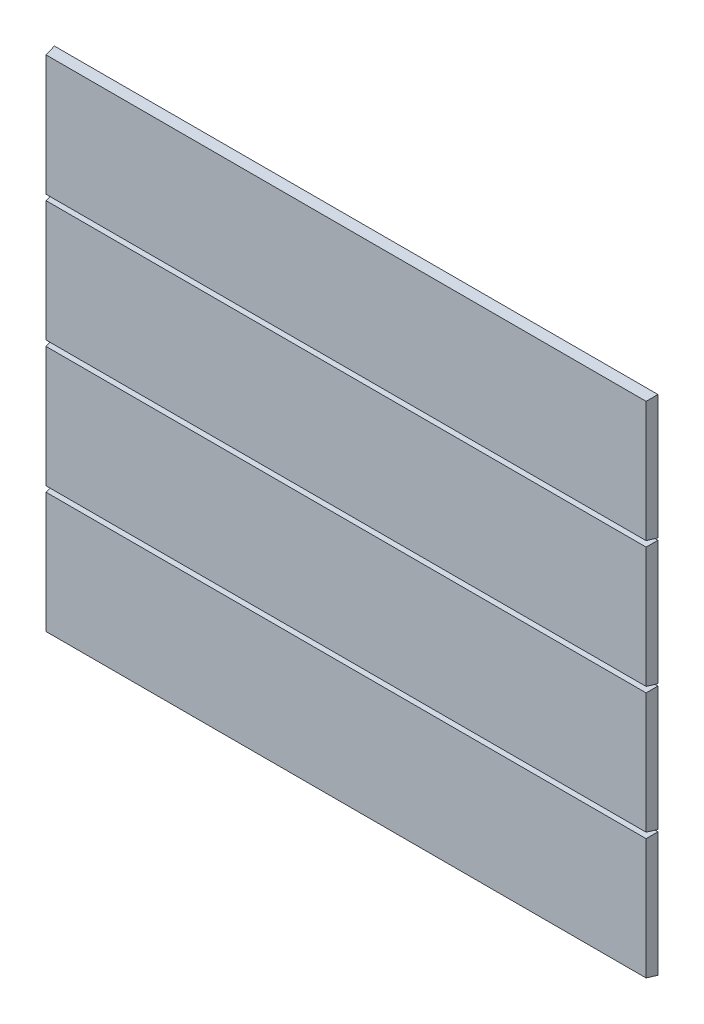
ISO-10303-21;
HEADER;
FILE_DESCRIPTION(('STEP AP214'),'2;1');
FILE_NAME('part.step','',(''),(''),'','','');
FILE_SCHEMA(('AUTOMOTIVE_DESIGN { 1 0 10303 214 1 1 1 1 }'));
ENDSEC;
DATA;
#1=APPLICATION_CONTEXT('core data for automotive mechanical design processes');
#2=APPLICATION_PROTOCOL_DEFINITION('international standard','automotive_design',2000,#1);
#3=PRODUCT_CONTEXT('',#1,'mechanical');
#4=PRODUCT('Part','Part','',(#3));
#5=PRODUCT_RELATED_PRODUCT_CATEGORY('part','',(#4));
#6=PRODUCT_DEFINITION_FORMATION('','',#4);
#7=PRODUCT_DEFINITION_CONTEXT('part definition',#1,'design');
#8=PRODUCT_DEFINITION('design','',#6,#7);
#9=PRODUCT_DEFINITION_SHAPE('','',#8);
#10=(LENGTH_UNIT() NAMED_UNIT(*) SI_UNIT(.MILLI.,.METRE.));
#11=(NAMED_UNIT(*) PLANE_ANGLE_UNIT() SI_UNIT($,.RADIAN.));
#12=(NAMED_UNIT(*) SI_UNIT($,.STERADIAN.) SOLID_ANGLE_UNIT());
#13=UNCERTAINTY_MEASURE_WITH_UNIT(LENGTH_MEASURE(1.E-05),#10,'distance_accuracy_value','');
#14=(GEOMETRIC_REPRESENTATION_CONTEXT(3) GLOBAL_UNCERTAINTY_ASSIGNED_CONTEXT((#13)) GLOBAL_UNIT_ASSIGNED_CONTEXT((#10,
#11,#12)) REPRESENTATION_CONTEXT('',''));
#15=CARTESIAN_POINT('',(0.,0.,0.));
#16=DIRECTION('',(0.,0.,1.));
#17=DIRECTION('',(1.,0.,0.));
#18=AXIS2_PLACEMENT_3D('',#15,#16,#17);
#19=CARTESIAN_POINT('',(-1500.,-2005.95542544023,0.));
#20=DIRECTION('',(-0.984807753012208,0.,0.17364817766693));
#21=DIRECTION('',(0.17364817766693,0.,0.984807753012208));
#22=AXIS2_PLACEMENT_3D('',#19,#20,#21);
#23=PLANE('',#22);
#24=DIRECTION('',(0.,-1.,0.));
#25=VECTOR('',#24,1.);
#26=CARTESIAN_POINT('',(-1500.,-2005.95542544023,0.));
#27=LINE('',#26,#25);
#28=CARTESIAN_POINT('',(-1500.,-2005.95542544023,0.));
#29=VERTEX_POINT('',#28);
#30=CARTESIAN_POINT('',(-1500.,-2623.45542544023,0.));
#31=VERTEX_POINT('',#30);
#32=EDGE_CURVE('E12',#29,#31,#27,.T.);
#33=ORIENTED_EDGE('',*,*,#32,.T.);
#34=DIRECTION('',(-0.171087869746036,-0.171087869746036,-0.970287525247814));
#35=VECTOR('',#34,1.);
#36=CARTESIAN_POINT('',(-1500.,-2623.45542544023,0.));
#37=LINE('',#36,#35);
#38=CARTESIAN_POINT('',(-1491.18365096458,-2614.63907640481,50.));
#39=VERTEX_POINT('',#38);
#40=EDGE_CURVE('E115',#39,#31,#37,.T.);
#41=ORIENTED_EDGE('',*,*,#40,.F.);
#42=DIRECTION('',(0.,1.,0.));
#43=VECTOR('',#42,1.);
#44=CARTESIAN_POINT('',(-1491.18365096458,-2005.95542544023,50.));
#45=LINE('',#44,#43);
#46=CARTESIAN_POINT('',(-1491.18365096458,-2014.77177447566,50.));
#47=VERTEX_POINT('',#46);
#48=EDGE_CURVE('E99',#47,#39,#45,.F.);
#49=ORIENTED_EDGE('',*,*,#48,.F.);
#50=DIRECTION('',(-0.171087869746036,0.171087869746036,-0.970287525247814));
#51=VECTOR('',#50,1.);
#52=CARTESIAN_POINT('',(-1500.,-2005.95542544023,0.));
#53=LINE('',#52,#51);
#54=EDGE_CURVE('E106',#47,#29,#53,.T.);
#55=ORIENTED_EDGE('',*,*,#54,.T.);
#56=EDGE_LOOP('',(#33,#41,#49,#55));
#57=FACE_BOUND('',#56,.T.);
#58=ADVANCED_FACE('F56',(#57),#23,.T.);
#59=CARTESIAN_POINT('',(-1500.,-2623.45542544023,0.));
#60=DIRECTION('',(0.,-0.984807753012208,0.17364817766693));
#61=DIRECTION('',(0.,-0.17364817766693,-0.984807753012208));
#62=AXIS2_PLACEMENT_3D('',#59,#60,#61);
#63=PLANE('',#62);
#64=DIRECTION('',(1.,0.,0.));
#65=VECTOR('',#64,1.);
#66=CARTESIAN_POINT('',(-1500.,-2623.45542544023,0.));
#67=LINE('',#66,#65);
#68=CARTESIAN_POINT('',(1500.,-2623.45542544023,0.));
#69=VERTEX_POINT('',#68);
#70=EDGE_CURVE('E64',#31,#69,#67,.T.);
#71=ORIENTED_EDGE('',*,*,#70,.T.);
#72=DIRECTION('',(0.171087869746036,-0.171087869746036,-0.970287525247814));
#73=VECTOR('',#72,1.);
#74=CARTESIAN_POINT('',(1481.92512095991,-2605.38054640014,102.507732891857));
#75=LINE('',#74,#73);
#76=CARTESIAN_POINT('',(1491.18365096458,-2614.63907640481,50.));
#77=VERTEX_POINT('',#76);
#78=EDGE_CURVE('E123',#77,#69,#75,.T.);
#79=ORIENTED_EDGE('',*,*,#78,.F.);
#80=DIRECTION('',(-1.,0.,0.));
#81=VECTOR('',#80,1.);
#82=CARTESIAN_POINT('',(-1500.,-2614.63907640481,50.));
#83=LINE('',#82,#81);
#84=EDGE_CURVE('E116',#39,#77,#83,.F.);
#85=ORIENTED_EDGE('',*,*,#84,.F.);
#86=ORIENTED_EDGE('',*,*,#40,.T.);
#87=EDGE_LOOP('',(#71,#79,#85,#86));
#88=FACE_BOUND('',#87,.T.);
#89=ADVANCED_FACE('F136',(#88),#63,.T.);
#90=CARTESIAN_POINT('',(1500.,-2005.95542544023,0.));
#91=DIRECTION('',(0.984807753012208,0.,0.17364817766693));
#92=DIRECTION('',(0.17364817766693,0.,-0.984807753012208));
#93=AXIS2_PLACEMENT_3D('',#90,#91,#92);
#94=PLANE('',#93);
#95=DIRECTION('',(0.,1.,0.));
#96=VECTOR('',#95,1.);
#97=CARTESIAN_POINT('',(1500.,-2005.95542544023,0.));
#98=LINE('',#97,#96);
#99=CARTESIAN_POINT('',(1500.,-2005.95542544023,0.));
#100=VERTEX_POINT('',#99);
#101=EDGE_CURVE('E118',#69,#100,#98,.T.);
#102=ORIENTED_EDGE('',*,*,#101,.T.);
#103=DIRECTION('',(0.171087869746035,0.171087869746036,-0.970287525247814));
#104=VECTOR('',#103,1.);
#105=CARTESIAN_POINT('',(1412.18682247729,-2093.76860296294,498.013277207403));
#106=LINE('',#105,#104);
#107=CARTESIAN_POINT('',(1491.18365096458,-2014.77177447566,50.));
#108=VERTEX_POINT('',#107);
#109=EDGE_CURVE('E113',#108,#100,#106,.T.);
#110=ORIENTED_EDGE('',*,*,#109,.F.);
#111=DIRECTION('',(0.,-1.,0.));
#112=VECTOR('',#111,1.);
#113=CARTESIAN_POINT('',(1491.18365096458,-2005.95542544023,50.));
#114=LINE('',#113,#112);
#115=EDGE_CURVE('E102',#77,#108,#114,.F.);
#116=ORIENTED_EDGE('',*,*,#115,.F.);
#117=ORIENTED_EDGE('',*,*,#78,.T.);
#118=EDGE_LOOP('',(#102,#110,#116,#117));
#119=FACE_BOUND('',#118,.T.);
#120=ADVANCED_FACE('F128',(#119),#94,.T.);
#121=CARTESIAN_POINT('',(-1500.,-2005.95542544023,0.));
#122=DIRECTION('',(0.,0.984807753012208,0.17364817766693));
#123=DIRECTION('',(0.,-0.17364817766693,0.984807753012208));
#124=AXIS2_PLACEMENT_3D('',#121,#122,#123);
#125=PLANE('',#124);
#126=DIRECTION('',(-1.,0.,0.));
#127=VECTOR('',#126,1.);
#128=CARTESIAN_POINT('',(-1500.,-2005.95542544023,0.));
#129=LINE('',#128,#127);
#130=EDGE_CURVE('E111',#100,#29,#129,.T.);
#131=ORIENTED_EDGE('',*,*,#130,.T.);
#132=ORIENTED_EDGE('',*,*,#54,.F.);
#133=DIRECTION('',(1.,0.,0.));
#134=VECTOR('',#133,1.);
#135=CARTESIAN_POINT('',(-1500.,-2014.77177447566,50.));
#136=LINE('',#135,#134);
#137=EDGE_CURVE('E96',#108,#47,#136,.F.);
#138=ORIENTED_EDGE('',*,*,#137,.F.);
#139=ORIENTED_EDGE('',*,*,#109,.T.);
#140=EDGE_LOOP('',(#131,#132,#138,#139));
#141=FACE_BOUND('',#140,.T.);
#142=ADVANCED_FACE('F109',(#141),#125,.T.);
#143=CARTESIAN_POINT('',(0.,0.,50.));
#144=DIRECTION('',(0.,0.,1.));
#145=DIRECTION('',(1.,0.,0.));
#146=AXIS2_PLACEMENT_3D('',#143,#144,#145);
#147=PLANE('',#146);
#148=ORIENTED_EDGE('',*,*,#48,.T.);
#149=ORIENTED_EDGE('',*,*,#84,.T.);
#150=ORIENTED_EDGE('',*,*,#115,.T.);
#151=ORIENTED_EDGE('',*,*,#137,.T.);
#152=EDGE_LOOP('',(#148,#149,#150,#151));
#153=FACE_BOUND('',#152,.T.);
#154=ADVANCED_FACE('F58',(#153),#147,.T.);
#155=CARTESIAN_POINT('',(0.,0.,0.));
#156=DIRECTION('',(0.,0.,1.));
#157=DIRECTION('',(1.,0.,0.));
#158=AXIS2_PLACEMENT_3D('',#155,#156,#157);
#159=PLANE('',#158);
#160=ORIENTED_EDGE('',*,*,#32,.F.);
#161=ORIENTED_EDGE('',*,*,#130,.F.);
#162=ORIENTED_EDGE('',*,*,#101,.F.);
#163=ORIENTED_EDGE('',*,*,#70,.F.);
#164=EDGE_LOOP('',(#160,#161,#162,#163));
#165=FACE_BOUND('',#164,.T.);
#166=ADVANCED_FACE('F129',(#165),#159,.F.);
#167=CLOSED_SHELL('',(#58,#89,#120,#142,#154,#166));
#168=MANIFOLD_SOLID_BREP('B2',#167);
#169=CARTESIAN_POINT('',(-1500.,-1378.45542544023,0.));
#170=DIRECTION('',(-0.984807753012208,0.,0.17364817766693));
#171=DIRECTION('',(0.17364817766693,0.,0.984807753012208));
#172=AXIS2_PLACEMENT_3D('',#169,#170,#171);
#173=PLANE('',#172);
#174=DIRECTION('',(0.,-1.,0.));
#175=VECTOR('',#174,1.);
#176=CARTESIAN_POINT('',(-1500.,-1378.45542544023,0.));
#177=LINE('',#176,#175);
#178=CARTESIAN_POINT('',(-1500.,-1378.45542544023,0.));
#179=VERTEX_POINT('',#178);
#180=CARTESIAN_POINT('',(-1500.,-1995.95542544023,0.));
#181=VERTEX_POINT('',#180);
#182=EDGE_CURVE('E54',#179,#181,#177,.T.);
#183=ORIENTED_EDGE('',*,*,#182,.T.);
#184=DIRECTION('',(-0.171087869746035,-0.171087869746036,-0.970287525247814));
#185=VECTOR('',#184,1.);
#186=CARTESIAN_POINT('',(-1500.,-1995.95542544023,0.));
#187=LINE('',#186,#185);
#188=CARTESIAN_POINT('',(-1491.18365096458,-1987.13907640481,50.));
#189=VERTEX_POINT('',#188);
#190=EDGE_CURVE('E249',#189,#181,#187,.T.);
#191=ORIENTED_EDGE('',*,*,#190,.F.);
#192=DIRECTION('',(0.,1.,0.));
#193=VECTOR('',#192,1.);
#194=CARTESIAN_POINT('',(-1491.18365096458,-1378.45542544023,50.));
#195=LINE('',#194,#193);
#196=CARTESIAN_POINT('',(-1491.18365096458,-1387.27177447566,50.));
#197=VERTEX_POINT('',#196);
#198=EDGE_CURVE('E233',#197,#189,#195,.F.);
#199=ORIENTED_EDGE('',*,*,#198,.F.);
#200=DIRECTION('',(-0.171087869746036,0.171087869746036,-0.970287525247814));
#201=VECTOR('',#200,1.);
#202=CARTESIAN_POINT('',(-1500.,-1378.45542544023,0.));
#203=LINE('',#202,#201);
#204=EDGE_CURVE('E240',#197,#179,#203,.T.);
#205=ORIENTED_EDGE('',*,*,#204,.T.);
#206=EDGE_LOOP('',(#183,#191,#199,#205));
#207=FACE_BOUND('',#206,.T.);
#208=ADVANCED_FACE('F190',(#207),#173,.T.);
#209=CARTESIAN_POINT('',(-1500.,-1995.95542544023,0.));
#210=DIRECTION('',(0.,-0.984807753012208,0.17364817766693));
#211=DIRECTION('',(0.,-0.17364817766693,-0.984807753012208));
#212=AXIS2_PLACEMENT_3D('',#209,#210,#211);
#213=PLANE('',#212);
#214=DIRECTION('',(1.,0.,0.));
#215=VECTOR('',#214,1.);
#216=CARTESIAN_POINT('',(-1500.,-1995.95542544023,0.));
#217=LINE('',#216,#215);
#218=CARTESIAN_POINT('',(1500.,-1995.95542544023,0.));
#219=VERTEX_POINT('',#218);
#220=EDGE_CURVE('E198',#181,#219,#217,.T.);
#221=ORIENTED_EDGE('',*,*,#220,.T.);
#222=DIRECTION('',(0.171087869746036,-0.171087869746036,-0.970287525247814));
#223=VECTOR('',#222,1.);
#224=CARTESIAN_POINT('',(1481.92512095991,-1977.88054640014,102.507732891857));
#225=LINE('',#224,#223);
#226=CARTESIAN_POINT('',(1491.18365096458,-1987.13907640481,50.));
#227=VERTEX_POINT('',#226);
#228=EDGE_CURVE('E257',#227,#219,#225,.T.);
#229=ORIENTED_EDGE('',*,*,#228,.F.);
#230=DIRECTION('',(-1.,0.,0.));
#231=VECTOR('',#230,1.);
#232=CARTESIAN_POINT('',(-1500.,-1987.13907640481,50.));
#233=LINE('',#232,#231);
#234=EDGE_CURVE('E250',#189,#227,#233,.F.);
#235=ORIENTED_EDGE('',*,*,#234,.F.);
#236=ORIENTED_EDGE('',*,*,#190,.T.);
#237=EDGE_LOOP('',(#221,#229,#235,#236));
#238=FACE_BOUND('',#237,.T.);
#239=ADVANCED_FACE('F270',(#238),#213,.T.);
#240=CARTESIAN_POINT('',(1500.,-1378.45542544023,0.));
#241=DIRECTION('',(0.984807753012208,0.,0.17364817766693));
#242=DIRECTION('',(0.17364817766693,0.,-0.984807753012208));
#243=AXIS2_PLACEMENT_3D('',#240,#241,#242);
#244=PLANE('',#243);
#245=DIRECTION('',(0.,1.,0.));
#246=VECTOR('',#245,1.);
#247=CARTESIAN_POINT('',(1500.,-1378.45542544023,0.));
#248=LINE('',#247,#246);
#249=CARTESIAN_POINT('',(1500.,-1378.45542544023,0.));
#250=VERTEX_POINT('',#249);
#251=EDGE_CURVE('E252',#219,#250,#248,.T.);
#252=ORIENTED_EDGE('',*,*,#251,.T.);
#253=DIRECTION('',(0.171087869746035,0.171087869746036,-0.970287525247814));
#254=VECTOR('',#253,1.);
#255=CARTESIAN_POINT('',(1412.18682247729,-1466.26860296294,498.013277207403));
#256=LINE('',#255,#254);
#257=CARTESIAN_POINT('',(1491.18365096458,-1387.27177447566,50.));
#258=VERTEX_POINT('',#257);
#259=EDGE_CURVE('E247',#258,#250,#256,.T.);
#260=ORIENTED_EDGE('',*,*,#259,.F.);
#261=DIRECTION('',(0.,-1.,0.));
#262=VECTOR('',#261,1.);
#263=CARTESIAN_POINT('',(1491.18365096458,-1378.45542544023,50.));
#264=LINE('',#263,#262);
#265=EDGE_CURVE('E236',#227,#258,#264,.F.);
#266=ORIENTED_EDGE('',*,*,#265,.F.);
#267=ORIENTED_EDGE('',*,*,#228,.T.);
#268=EDGE_LOOP('',(#252,#260,#266,#267));
#269=FACE_BOUND('',#268,.T.);
#270=ADVANCED_FACE('F262',(#269),#244,.T.);
#271=CARTESIAN_POINT('',(-1500.,-1378.45542544023,0.));
#272=DIRECTION('',(0.,0.984807753012208,0.17364817766693));
#273=DIRECTION('',(0.,-0.17364817766693,0.984807753012208));
#274=AXIS2_PLACEMENT_3D('',#271,#272,#273);
#275=PLANE('',#274);
#276=DIRECTION('',(-1.,0.,0.));
#277=VECTOR('',#276,1.);
#278=CARTESIAN_POINT('',(-1500.,-1378.45542544023,0.));
#279=LINE('',#278,#277);
#280=EDGE_CURVE('E245',#250,#179,#279,.T.);
#281=ORIENTED_EDGE('',*,*,#280,.T.);
#282=ORIENTED_EDGE('',*,*,#204,.F.);
#283=DIRECTION('',(1.,0.,0.));
#284=VECTOR('',#283,1.);
#285=CARTESIAN_POINT('',(-1500.,-1387.27177447566,50.));
#286=LINE('',#285,#284);
#287=EDGE_CURVE('E230',#258,#197,#286,.F.);
#288=ORIENTED_EDGE('',*,*,#287,.F.);
#289=ORIENTED_EDGE('',*,*,#259,.T.);
#290=EDGE_LOOP('',(#281,#282,#288,#289));
#291=FACE_BOUND('',#290,.T.);
#292=ADVANCED_FACE('F243',(#291),#275,.T.);
#293=CARTESIAN_POINT('',(0.,0.,50.));
#294=DIRECTION('',(0.,0.,1.));
#295=DIRECTION('',(1.,0.,0.));
#296=AXIS2_PLACEMENT_3D('',#293,#294,#295);
#297=PLANE('',#296);
#298=ORIENTED_EDGE('',*,*,#198,.T.);
#299=ORIENTED_EDGE('',*,*,#234,.T.);
#300=ORIENTED_EDGE('',*,*,#265,.T.);
#301=ORIENTED_EDGE('',*,*,#287,.T.);
#302=EDGE_LOOP('',(#298,#299,#300,#301));
#303=FACE_BOUND('',#302,.T.);
#304=ADVANCED_FACE('F192',(#303),#297,.T.);
#305=CARTESIAN_POINT('',(0.,0.,0.));
#306=DIRECTION('',(0.,0.,1.));
#307=DIRECTION('',(1.,0.,0.));
#308=AXIS2_PLACEMENT_3D('',#305,#306,#307);
#309=PLANE('',#308);
#310=ORIENTED_EDGE('',*,*,#182,.F.);
#311=ORIENTED_EDGE('',*,*,#280,.F.);
#312=ORIENTED_EDGE('',*,*,#251,.F.);
#313=ORIENTED_EDGE('',*,*,#220,.F.);
#314=EDGE_LOOP('',(#310,#311,#312,#313));
#315=FACE_BOUND('',#314,.T.);
#316=ADVANCED_FACE('F263',(#315),#309,.F.);
#317=CLOSED_SHELL('',(#208,#239,#270,#292,#304,#316));
#318=MANIFOLD_SOLID_BREP('B6',#317);
#319=CARTESIAN_POINT('',(-1500.,-750.955425440232,0.));
#320=DIRECTION('',(-0.984807753012208,0.,0.17364817766693));
#321=DIRECTION('',(0.17364817766693,0.,0.984807753012208));
#322=AXIS2_PLACEMENT_3D('',#319,#320,#321);
#323=PLANE('',#322);
#324=DIRECTION('',(0.,-1.,0.));
#325=VECTOR('',#324,1.);
#326=CARTESIAN_POINT('',(-1500.,-750.955425440232,0.));
#327=LINE('',#326,#325);
#328=CARTESIAN_POINT('',(-1500.,-750.955425440232,0.));
#329=VERTEX_POINT('',#328);
#330=CARTESIAN_POINT('',(-1500.,-1368.45542544023,0.));
#331=VERTEX_POINT('',#330);
#332=EDGE_CURVE('E188',#329,#331,#327,.T.);
#333=ORIENTED_EDGE('',*,*,#332,.T.);
#334=DIRECTION('',(-0.171087869746036,-0.171087869746036,-0.970287525247814));
#335=VECTOR('',#334,1.);
#336=CARTESIAN_POINT('',(-1500.,-1368.45542544023,0.));
#337=LINE('',#336,#335);
#338=CARTESIAN_POINT('',(-1491.18365096458,-1359.63907640481,50.));
#339=VERTEX_POINT('',#338);
#340=EDGE_CURVE('E382',#339,#331,#337,.T.);
#341=ORIENTED_EDGE('',*,*,#340,.F.);
#342=DIRECTION('',(0.,1.,0.));
#343=VECTOR('',#342,1.);
#344=CARTESIAN_POINT('',(-1491.18365096458,-750.955425440232,50.));
#345=LINE('',#344,#343);
#346=CARTESIAN_POINT('',(-1491.18365096458,-759.771774475655,50.));
#347=VERTEX_POINT('',#346);
#348=EDGE_CURVE('E366',#347,#339,#345,.F.);
#349=ORIENTED_EDGE('',*,*,#348,.F.);
#350=DIRECTION('',(-0.171087869746036,0.171087869746036,-0.970287525247814));
#351=VECTOR('',#350,1.);
#352=CARTESIAN_POINT('',(-1500.,-750.955425440232,0.));
#353=LINE('',#352,#351);
#354=EDGE_CURVE('E373',#347,#329,#353,.T.);
#355=ORIENTED_EDGE('',*,*,#354,.T.);
#356=EDGE_LOOP('',(#333,#341,#349,#355));
#357=FACE_BOUND('',#356,.T.);
#358=ADVANCED_FACE('F323',(#357),#323,.T.);
#359=CARTESIAN_POINT('',(-1500.,-1368.45542544023,0.));
#360=DIRECTION('',(0.,-0.984807753012208,0.17364817766693));
#361=DIRECTION('',(0.,-0.17364817766693,-0.984807753012208));
#362=AXIS2_PLACEMENT_3D('',#359,#360,#361);
#363=PLANE('',#362);
#364=DIRECTION('',(1.,0.,0.));
#365=VECTOR('',#364,1.);
#366=CARTESIAN_POINT('',(-1500.,-1368.45542544023,0.));
#367=LINE('',#366,#365);
#368=CARTESIAN_POINT('',(1500.,-1368.45542544023,0.));
#369=VERTEX_POINT('',#368);
#370=EDGE_CURVE('E331',#331,#369,#367,.T.);
#371=ORIENTED_EDGE('',*,*,#370,.T.);
#372=DIRECTION('',(0.171087869746036,-0.171087869746036,-0.970287525247814));
#373=VECTOR('',#372,1.);
#374=CARTESIAN_POINT('',(1481.92512095991,-1350.38054640014,102.507732891857));
#375=LINE('',#374,#373);
#376=CARTESIAN_POINT('',(1491.18365096458,-1359.63907640481,50.));
#377=VERTEX_POINT('',#376);
#378=EDGE_CURVE('E390',#377,#369,#375,.T.);
#379=ORIENTED_EDGE('',*,*,#378,.F.);
#380=DIRECTION('',(-1.,0.,0.));
#381=VECTOR('',#380,1.);
#382=CARTESIAN_POINT('',(-1500.,-1359.63907640481,50.));
#383=LINE('',#382,#381);
#384=EDGE_CURVE('E383',#339,#377,#383,.F.);
#385=ORIENTED_EDGE('',*,*,#384,.F.);
#386=ORIENTED_EDGE('',*,*,#340,.T.);
#387=EDGE_LOOP('',(#371,#379,#385,#386));
#388=FACE_BOUND('',#387,.T.);
#389=ADVANCED_FACE('F403',(#388),#363,.T.);
#390=CARTESIAN_POINT('',(1500.,-750.955425440232,0.));
#391=DIRECTION('',(0.984807753012208,0.,0.17364817766693));
#392=DIRECTION('',(0.17364817766693,0.,-0.984807753012208));
#393=AXIS2_PLACEMENT_3D('',#390,#391,#392);
#394=PLANE('',#393);
#395=DIRECTION('',(0.,1.,0.));
#396=VECTOR('',#395,1.);
#397=CARTESIAN_POINT('',(1500.,-750.955425440232,0.));
#398=LINE('',#397,#396);
#399=CARTESIAN_POINT('',(1500.,-750.955425440232,0.));
#400=VERTEX_POINT('',#399);
#401=EDGE_CURVE('E385',#369,#400,#398,.T.);
#402=ORIENTED_EDGE('',*,*,#401,.T.);
#403=DIRECTION('',(0.171087869746036,0.171087869746036,-0.970287525247814));
#404=VECTOR('',#403,1.);
#405=CARTESIAN_POINT('',(1412.18682247729,-838.768602962941,498.013277207403));
#406=LINE('',#405,#404);
#407=CARTESIAN_POINT('',(1491.18365096458,-759.771774475655,50.));
#408=VERTEX_POINT('',#407);
#409=EDGE_CURVE('E380',#408,#400,#406,.T.);
#410=ORIENTED_EDGE('',*,*,#409,.F.);
#411=DIRECTION('',(0.,-1.,0.));
#412=VECTOR('',#411,1.);
#413=CARTESIAN_POINT('',(1491.18365096458,-750.955425440232,50.));
#414=LINE('',#413,#412);
#415=EDGE_CURVE('E369',#377,#408,#414,.F.);
#416=ORIENTED_EDGE('',*,*,#415,.F.);
#417=ORIENTED_EDGE('',*,*,#378,.T.);
#418=EDGE_LOOP('',(#402,#410,#416,#417));
#419=FACE_BOUND('',#418,.T.);
#420=ADVANCED_FACE('F395',(#419),#394,.T.);
#421=CARTESIAN_POINT('',(-1500.,-750.955425440232,0.));
#422=DIRECTION('',(0.,0.984807753012208,0.17364817766693));
#423=DIRECTION('',(0.,-0.17364817766693,0.984807753012208));
#424=AXIS2_PLACEMENT_3D('',#421,#422,#423);
#425=PLANE('',#424);
#426=DIRECTION('',(-1.,0.,0.));
#427=VECTOR('',#426,1.);
#428=CARTESIAN_POINT('',(-1500.,-750.955425440232,0.));
#429=LINE('',#428,#427);
#430=EDGE_CURVE('E378',#400,#329,#429,.T.);
#431=ORIENTED_EDGE('',*,*,#430,.T.);
#432=ORIENTED_EDGE('',*,*,#354,.F.);
#433=DIRECTION('',(1.,0.,0.));
#434=VECTOR('',#433,1.);
#435=CARTESIAN_POINT('',(-1500.,-759.771774475655,50.));
#436=LINE('',#435,#434);
#437=EDGE_CURVE('E363',#408,#347,#436,.F.);
#438=ORIENTED_EDGE('',*,*,#437,.F.);
#439=ORIENTED_EDGE('',*,*,#409,.T.);
#440=EDGE_LOOP('',(#431,#432,#438,#439));
#441=FACE_BOUND('',#440,.T.);
#442=ADVANCED_FACE('F376',(#441),#425,.T.);
#443=CARTESIAN_POINT('',(0.,0.,50.));
#444=DIRECTION('',(0.,0.,1.));
#445=DIRECTION('',(1.,0.,0.));
#446=AXIS2_PLACEMENT_3D('',#443,#444,#445);
#447=PLANE('',#446);
#448=ORIENTED_EDGE('',*,*,#348,.T.);
#449=ORIENTED_EDGE('',*,*,#384,.T.);
#450=ORIENTED_EDGE('',*,*,#415,.T.);
#451=ORIENTED_EDGE('',*,*,#437,.T.);
#452=EDGE_LOOP('',(#448,#449,#450,#451));
#453=FACE_BOUND('',#452,.T.);
#454=ADVANCED_FACE('F325',(#453),#447,.T.);
#455=CARTESIAN_POINT('',(0.,0.,0.));
#456=DIRECTION('',(0.,0.,1.));
#457=DIRECTION('',(1.,0.,0.));
#458=AXIS2_PLACEMENT_3D('',#455,#456,#457);
#459=PLANE('',#458);
#460=ORIENTED_EDGE('',*,*,#332,.F.);
#461=ORIENTED_EDGE('',*,*,#430,.F.);
#462=ORIENTED_EDGE('',*,*,#401,.F.);
#463=ORIENTED_EDGE('',*,*,#370,.F.);
#464=EDGE_LOOP('',(#460,#461,#462,#463));
#465=FACE_BOUND('',#464,.T.);
#466=ADVANCED_FACE('F396',(#465),#459,.F.);
#467=CLOSED_SHELL('',(#358,#389,#420,#442,#454,#466));
#468=MANIFOLD_SOLID_BREP('B48',#467);
#469=CARTESIAN_POINT('',(-1500.,-123.455425440232,0.));
#470=DIRECTION('',(-0.984807753012208,0.,0.17364817766693));
#471=DIRECTION('',(0.17364817766693,0.,0.984807753012208));
#472=AXIS2_PLACEMENT_3D('',#469,#470,#471);
#473=PLANE('',#472);
#474=DIRECTION('',(0.,-1.,0.));
#475=VECTOR('',#474,1.);
#476=CARTESIAN_POINT('',(-1500.,-123.455425440232,0.));
#477=LINE('',#476,#475);
#478=CARTESIAN_POINT('',(-1500.,-123.455425440232,0.));
#479=VERTEX_POINT('',#478);
#480=CARTESIAN_POINT('',(-1500.,-740.955425440232,0.));
#481=VERTEX_POINT('',#480);
#482=EDGE_CURVE('E493',#479,#481,#477,.T.);
#483=ORIENTED_EDGE('',*,*,#482,.T.);
#484=DIRECTION('',(-0.171087869746036,-0.171087869746036,-0.970287525247814));
#485=VECTOR('',#484,1.);
#486=CARTESIAN_POINT('',(-1500.,-740.955425440232,0.));
#487=LINE('',#486,#485);
#488=CARTESIAN_POINT('',(-1491.18365096458,-732.139076404809,50.));
#489=VERTEX_POINT('',#488);
#490=EDGE_CURVE('E321',#489,#481,#487,.T.);
#491=ORIENTED_EDGE('',*,*,#490,.F.);
#492=DIRECTION('',(0.,1.,0.));
#493=VECTOR('',#492,1.);
#494=CARTESIAN_POINT('',(-1491.18365096458,-123.455425440232,50.));
#495=LINE('',#494,#493);
#496=CARTESIAN_POINT('',(-1491.18365096458,-132.271774475655,50.));
#497=VERTEX_POINT('',#496);
#498=EDGE_CURVE('E509',#497,#489,#495,.F.);
#499=ORIENTED_EDGE('',*,*,#498,.F.);
#500=DIRECTION('',(-0.171087869746036,0.171087869746036,-0.970287525247814));
#501=VECTOR('',#500,1.);
#502=CARTESIAN_POINT('',(-1500.,-123.455425440232,0.));
#503=LINE('',#502,#501);
#504=EDGE_CURVE('E504',#497,#479,#503,.T.);
#505=ORIENTED_EDGE('',*,*,#504,.T.);
#506=EDGE_LOOP('',(#483,#491,#499,#505));
#507=FACE_BOUND('',#506,.T.);
#508=ADVANCED_FACE('F447',(#507),#473,.T.);
#509=CARTESIAN_POINT('',(-1500.,-740.955425440232,0.));
#510=DIRECTION('',(0.,-0.984807753012208,0.17364817766693));
#511=DIRECTION('',(0.,-0.17364817766693,-0.984807753012208));
#512=AXIS2_PLACEMENT_3D('',#509,#510,#511);
#513=PLANE('',#512);
#514=DIRECTION('',(1.,0.,0.));
#515=VECTOR('',#514,1.);
#516=CARTESIAN_POINT('',(-1500.,-740.955425440232,0.));
#517=LINE('',#516,#515);
#518=CARTESIAN_POINT('',(1500.,-740.955425440232,0.));
#519=VERTEX_POINT('',#518);
#520=EDGE_CURVE('E489',#481,#519,#517,.T.);
#521=ORIENTED_EDGE('',*,*,#520,.T.);
#522=DIRECTION('',(0.171087869746036,-0.171087869746036,-0.970287525247814));
#523=VECTOR('',#522,1.);
#524=CARTESIAN_POINT('',(1481.92512095991,-722.880546400141,102.507732891857));
#525=LINE('',#524,#523);
#526=CARTESIAN_POINT('',(1491.18365096458,-732.139076404809,50.));
#527=VERTEX_POINT('',#526);
#528=EDGE_CURVE('E456',#527,#519,#525,.T.);
#529=ORIENTED_EDGE('',*,*,#528,.F.);
#530=DIRECTION('',(-1.,0.,0.));
#531=VECTOR('',#530,1.);
#532=CARTESIAN_POINT('',(-1500.,-732.139076404809,50.));
#533=LINE('',#532,#531);
#534=EDGE_CURVE('E500',#489,#527,#533,.F.);
#535=ORIENTED_EDGE('',*,*,#534,.F.);
#536=ORIENTED_EDGE('',*,*,#490,.T.);
#537=EDGE_LOOP('',(#521,#529,#535,#536));
#538=FACE_BOUND('',#537,.T.);
#539=ADVANCED_FACE('F449',(#538),#513,.T.);
#540=CARTESIAN_POINT('',(1500.,-123.455425440231,0.));
#541=DIRECTION('',(0.984807753012208,0.,0.17364817766693));
#542=DIRECTION('',(0.17364817766693,0.,-0.984807753012208));
#543=AXIS2_PLACEMENT_3D('',#540,#541,#542);
#544=PLANE('',#543);
#545=DIRECTION('',(0.,1.,0.));
#546=VECTOR('',#545,1.);
#547=CARTESIAN_POINT('',(1500.,-123.455425440231,0.));
#548=LINE('',#547,#546);
#549=CARTESIAN_POINT('',(1500.,-123.455425440231,0.));
#550=VERTEX_POINT('',#549);
#551=EDGE_CURVE('E494',#519,#550,#548,.T.);
#552=ORIENTED_EDGE('',*,*,#551,.T.);
#553=DIRECTION('',(0.171087869746036,0.171087869746036,-0.970287525247814));
#554=VECTOR('',#553,1.);
#555=CARTESIAN_POINT('',(1412.18682247729,-211.268602962941,498.013277207403));
#556=LINE('',#555,#554);
#557=CARTESIAN_POINT('',(1491.18365096458,-132.271774475655,50.));
#558=VERTEX_POINT('',#557);
#559=EDGE_CURVE('E512',#558,#550,#556,.T.);
#560=ORIENTED_EDGE('',*,*,#559,.F.);
#561=DIRECTION('',(0.,-1.,0.));
#562=VECTOR('',#561,1.);
#563=CARTESIAN_POINT('',(1491.18365096458,-123.455425440231,50.));
#564=LINE('',#563,#562);
#565=EDGE_CURVE('E468',#527,#558,#564,.F.);
#566=ORIENTED_EDGE('',*,*,#565,.F.);
#567=ORIENTED_EDGE('',*,*,#528,.T.);
#568=EDGE_LOOP('',(#552,#560,#566,#567));
#569=FACE_BOUND('',#568,.T.);
#570=ADVANCED_FACE('F519',(#569),#544,.T.);
#571=CARTESIAN_POINT('',(-1500.,-123.455425440232,0.));
#572=DIRECTION('',(0.,0.984807753012208,0.17364817766693));
#573=DIRECTION('',(0.,-0.17364817766693,0.984807753012208));
#574=AXIS2_PLACEMENT_3D('',#571,#572,#573);
#575=PLANE('',#574);
#576=DIRECTION('',(-1.,0.,0.));
#577=VECTOR('',#576,1.);
#578=CARTESIAN_POINT('',(-1500.,-123.455425440232,0.));
#579=LINE('',#578,#577);
#580=EDGE_CURVE('E508',#550,#479,#579,.T.);
#581=ORIENTED_EDGE('',*,*,#580,.T.);
#582=ORIENTED_EDGE('',*,*,#504,.F.);
#583=DIRECTION('',(1.,0.,0.));
#584=VECTOR('',#583,1.);
#585=CARTESIAN_POINT('',(-1500.,-132.271774475655,50.));
#586=LINE('',#585,#584);
#587=EDGE_CURVE('E451',#558,#497,#586,.F.);
#588=ORIENTED_EDGE('',*,*,#587,.F.);
#589=ORIENTED_EDGE('',*,*,#559,.T.);
#590=EDGE_LOOP('',(#581,#582,#588,#589));
#591=FACE_BOUND('',#590,.T.);
#592=ADVANCED_FACE('F521',(#591),#575,.T.);
#593=CARTESIAN_POINT('',(0.,0.,50.));
#594=DIRECTION('',(0.,0.,1.));
#595=DIRECTION('',(1.,0.,0.));
#596=AXIS2_PLACEMENT_3D('',#593,#594,#595);
#597=PLANE('',#596);
#598=ORIENTED_EDGE('',*,*,#498,.T.);
#599=ORIENTED_EDGE('',*,*,#534,.T.);
#600=ORIENTED_EDGE('',*,*,#565,.T.);
#601=ORIENTED_EDGE('',*,*,#587,.T.);
#602=EDGE_LOOP('',(#598,#599,#600,#601));
#603=FACE_BOUND('',#602,.T.);
#604=ADVANCED_FACE('F517',(#603),#597,.T.);
#605=CARTESIAN_POINT('',(0.,0.,0.));
#606=DIRECTION('',(0.,0.,1.));
#607=DIRECTION('',(1.,0.,0.));
#608=AXIS2_PLACEMENT_3D('',#605,#606,#607);
#609=PLANE('',#608);
#610=ORIENTED_EDGE('',*,*,#482,.F.);
#611=ORIENTED_EDGE('',*,*,#580,.F.);
#612=ORIENTED_EDGE('',*,*,#551,.F.);
#613=ORIENTED_EDGE('',*,*,#520,.F.);
#614=EDGE_LOOP('',(#610,#611,#612,#613));
#615=FACE_BOUND('',#614,.T.);
#616=ADVANCED_FACE('F490',(#615),#609,.F.);
#617=CLOSED_SHELL('',(#508,#539,#570,#592,#604,#616));
#618=MANIFOLD_SOLID_BREP('B182',#617);
#619=ADVANCED_BREP_SHAPE_REPRESENTATION('',(#18,#168,#318,#468,#618),#14);
#620=SHAPE_DEFINITION_REPRESENTATION(#9,#619);
ENDSEC;
END-ISO-10303-21;
